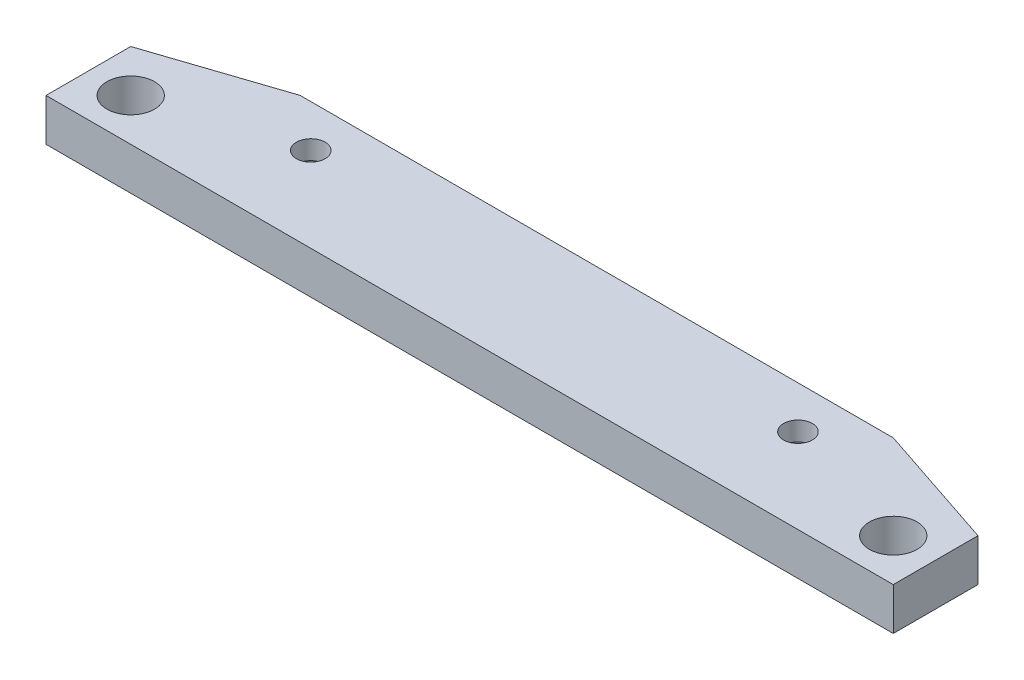
ISO-10303-21;
HEADER;
FILE_DESCRIPTION(('STEP AP214'),'2;1');
FILE_NAME('part.step','',(''),(''),'','','');
FILE_SCHEMA(('AUTOMOTIVE_DESIGN { 1 0 10303 214 1 1 1 1 }'));
ENDSEC;
DATA;
#1=APPLICATION_CONTEXT('core data for automotive mechanical design processes');
#2=APPLICATION_PROTOCOL_DEFINITION('international standard','automotive_design',2000,#1);
#3=PRODUCT_CONTEXT('',#1,'mechanical');
#4=PRODUCT('Part','Part','',(#3));
#5=PRODUCT_RELATED_PRODUCT_CATEGORY('part','',(#4));
#6=PRODUCT_DEFINITION_FORMATION('','',#4);
#7=PRODUCT_DEFINITION_CONTEXT('part definition',#1,'design');
#8=PRODUCT_DEFINITION('design','',#6,#7);
#9=PRODUCT_DEFINITION_SHAPE('','',#8);
#10=(LENGTH_UNIT() NAMED_UNIT(*) SI_UNIT(.MILLI.,.METRE.));
#11=(NAMED_UNIT(*) PLANE_ANGLE_UNIT() SI_UNIT($,.RADIAN.));
#12=(NAMED_UNIT(*) SI_UNIT($,.STERADIAN.) SOLID_ANGLE_UNIT());
#13=UNCERTAINTY_MEASURE_WITH_UNIT(LENGTH_MEASURE(1.E-05),#10,'distance_accuracy_value','');
#14=(GEOMETRIC_REPRESENTATION_CONTEXT(3) GLOBAL_UNCERTAINTY_ASSIGNED_CONTEXT((#13)) GLOBAL_UNIT_ASSIGNED_CONTEXT((#10,
#11,#12)) REPRESENTATION_CONTEXT('',''));
#15=CARTESIAN_POINT('',(0.,0.,0.));
#16=DIRECTION('',(0.,0.,1.));
#17=DIRECTION('',(1.,0.,0.));
#18=AXIS2_PLACEMENT_3D('',#15,#16,#17);
#19=CARTESIAN_POINT('',(-19.05,6.35,6.34999999999995));
#20=DIRECTION('',(-1.,0.,0.));
#21=DIRECTION('',(0.,0.,1.));
#22=AXIS2_PLACEMENT_3D('',#19,#20,#21);
#23=PLANE('',#22);
#24=DIRECTION('',(0.,0.,-1.));
#25=VECTOR('',#24,1.);
#26=CARTESIAN_POINT('',(-19.05,0.,6.34999999999995));
#27=LINE('',#26,#25);
#28=CARTESIAN_POINT('',(-19.05,0.,6.34999999999995));
#29=VERTEX_POINT('',#28);
#30=CARTESIAN_POINT('',(-19.05,0.,-6.35000000000002));
#31=VERTEX_POINT('',#30);
#32=EDGE_CURVE('E143',#29,#31,#27,.T.);
#33=ORIENTED_EDGE('',*,*,#32,.F.);
#34=DIRECTION('',(0.,-1.,0.));
#35=VECTOR('',#34,1.);
#36=CARTESIAN_POINT('',(-19.05,6.35,6.34999999999995));
#37=LINE('',#36,#35);
#38=CARTESIAN_POINT('',(-19.05,6.35,6.34999999999995));
#39=VERTEX_POINT('',#38);
#40=EDGE_CURVE('E11',#39,#29,#37,.T.);
#41=ORIENTED_EDGE('',*,*,#40,.F.);
#42=DIRECTION('',(0.,0.,-1.));
#43=VECTOR('',#42,1.);
#44=CARTESIAN_POINT('',(-19.05,6.35,6.34999999999995));
#45=LINE('',#44,#43);
#46=CARTESIAN_POINT('',(-19.05,6.35,-6.35000000000002));
#47=VERTEX_POINT('',#46);
#48=EDGE_CURVE('E162',#39,#47,#45,.T.);
#49=ORIENTED_EDGE('',*,*,#48,.T.);
#50=DIRECTION('',(0.,-1.,0.));
#51=VECTOR('',#50,1.);
#52=CARTESIAN_POINT('',(-19.05,6.35,-6.35000000000002));
#53=LINE('',#52,#51);
#54=EDGE_CURVE('E51',#47,#31,#53,.T.);
#55=ORIENTED_EDGE('',*,*,#54,.T.);
#56=EDGE_LOOP('',(#33,#41,#49,#55));
#57=FACE_BOUND('',#56,.T.);
#58=ADVANCED_FACE('F48',(#57),#23,.T.);
#59=CARTESIAN_POINT('',(-19.05,6.35,6.34999999999995));
#60=DIRECTION('',(0.,0.,-1.));
#61=DIRECTION('',(-1.,0.,0.));
#62=AXIS2_PLACEMENT_3D('',#59,#60,#61);
#63=PLANE('',#62);
#64=DIRECTION('',(1.,0.,0.));
#65=VECTOR('',#64,1.);
#66=CARTESIAN_POINT('',(-19.05,0.,6.34999999999995));
#67=LINE('',#66,#65);
#68=CARTESIAN_POINT('',(107.95,0.,6.34999999999998));
#69=VERTEX_POINT('',#68);
#70=EDGE_CURVE('E89',#29,#69,#67,.T.);
#71=ORIENTED_EDGE('',*,*,#70,.T.);
#72=DIRECTION('',(0.,-1.,0.));
#73=VECTOR('',#72,1.);
#74=CARTESIAN_POINT('',(107.95,6.35,6.34999999999998));
#75=LINE('',#74,#73);
#76=CARTESIAN_POINT('',(107.95,6.35,6.34999999999998));
#77=VERTEX_POINT('',#76);
#78=EDGE_CURVE('E58',#77,#69,#75,.T.);
#79=ORIENTED_EDGE('',*,*,#78,.F.);
#80=DIRECTION('',(1.,0.,0.));
#81=VECTOR('',#80,1.);
#82=CARTESIAN_POINT('',(-19.05,6.35,6.34999999999995));
#83=LINE('',#82,#81);
#84=EDGE_CURVE('E117',#39,#77,#83,.T.);
#85=ORIENTED_EDGE('',*,*,#84,.F.);
#86=ORIENTED_EDGE('',*,*,#40,.T.);
#87=EDGE_LOOP('',(#71,#79,#85,#86));
#88=FACE_BOUND('',#87,.T.);
#89=ADVANCED_FACE('F254',(#88),#63,.F.);
#90=CARTESIAN_POINT('',(107.95,6.35,6.34999999999998));
#91=DIRECTION('',(-1.,0.,0.));
#92=DIRECTION('',(0.,0.,1.));
#93=AXIS2_PLACEMENT_3D('',#90,#91,#92);
#94=PLANE('',#93);
#95=DIRECTION('',(0.,0.,-1.));
#96=VECTOR('',#95,1.);
#97=CARTESIAN_POINT('',(107.95,0.,6.34999999999998));
#98=LINE('',#97,#96);
#99=CARTESIAN_POINT('',(107.95,0.,-6.35000000000002));
#100=VERTEX_POINT('',#99);
#101=EDGE_CURVE('E125',#69,#100,#98,.T.);
#102=ORIENTED_EDGE('',*,*,#101,.T.);
#103=DIRECTION('',(0.,-1.,0.));
#104=VECTOR('',#103,1.);
#105=CARTESIAN_POINT('',(107.95,6.35,-6.35000000000002));
#106=LINE('',#105,#104);
#107=CARTESIAN_POINT('',(107.95,6.35,-6.35000000000002));
#108=VERTEX_POINT('',#107);
#109=EDGE_CURVE('E122',#108,#100,#106,.T.);
#110=ORIENTED_EDGE('',*,*,#109,.F.);
#111=DIRECTION('',(0.,0.,-1.));
#112=VECTOR('',#111,1.);
#113=CARTESIAN_POINT('',(107.95,6.35,6.34999999999998));
#114=LINE('',#113,#112);
#115=EDGE_CURVE('E109',#77,#108,#114,.T.);
#116=ORIENTED_EDGE('',*,*,#115,.F.);
#117=ORIENTED_EDGE('',*,*,#78,.T.);
#118=EDGE_LOOP('',(#102,#110,#116,#117));
#119=FACE_BOUND('',#118,.T.);
#120=ADVANCED_FACE('F123',(#119),#94,.F.);
#121=CARTESIAN_POINT('',(88.9,6.35,-12.7));
#122=DIRECTION('',(0.316227766016837,0.,-0.948683298050514));
#123=DIRECTION('',(-0.948683298050514,0.,-0.316227766016837));
#124=AXIS2_PLACEMENT_3D('',#121,#122,#123);
#125=PLANE('',#124);
#126=DIRECTION('',(0.948683298050514,0.,0.316227766016837));
#127=VECTOR('',#126,1.);
#128=CARTESIAN_POINT('',(88.9,0.,-12.7));
#129=LINE('',#128,#127);
#130=CARTESIAN_POINT('',(88.9,0.,-12.7));
#131=VERTEX_POINT('',#130);
#132=EDGE_CURVE('E156',#131,#100,#129,.T.);
#133=ORIENTED_EDGE('',*,*,#132,.F.);
#134=DIRECTION('',(0.,-1.,0.));
#135=VECTOR('',#134,1.);
#136=CARTESIAN_POINT('',(88.9,6.35,-12.7));
#137=LINE('',#136,#135);
#138=CARTESIAN_POINT('',(88.9,6.35,-12.7));
#139=VERTEX_POINT('',#138);
#140=EDGE_CURVE('E130',#139,#131,#137,.T.);
#141=ORIENTED_EDGE('',*,*,#140,.F.);
#142=DIRECTION('',(0.948683298050514,0.,0.316227766016837));
#143=VECTOR('',#142,1.);
#144=CARTESIAN_POINT('',(88.9,6.35,-12.7));
#145=LINE('',#144,#143);
#146=EDGE_CURVE('E115',#139,#108,#145,.T.);
#147=ORIENTED_EDGE('',*,*,#146,.T.);
#148=ORIENTED_EDGE('',*,*,#109,.T.);
#149=EDGE_LOOP('',(#133,#141,#147,#148));
#150=FACE_BOUND('',#149,.T.);
#151=ADVANCED_FACE('F132',(#150),#125,.T.);
#152=CARTESIAN_POINT('',(0.,6.35,-12.7));
#153=DIRECTION('',(0.,0.,-1.));
#154=DIRECTION('',(-1.,0.,0.));
#155=AXIS2_PLACEMENT_3D('',#152,#153,#154);
#156=PLANE('',#155);
#157=DIRECTION('',(1.,0.,0.));
#158=VECTOR('',#157,1.);
#159=CARTESIAN_POINT('',(0.,0.,-12.7));
#160=LINE('',#159,#158);
#161=CARTESIAN_POINT('',(0.,0.,-12.7));
#162=VERTEX_POINT('',#161);
#163=EDGE_CURVE('E152',#162,#131,#160,.T.);
#164=ORIENTED_EDGE('',*,*,#163,.F.);
#165=DIRECTION('',(0.,-1.,0.));
#166=VECTOR('',#165,1.);
#167=CARTESIAN_POINT('',(0.,6.35,-12.7));
#168=LINE('',#167,#166);
#169=CARTESIAN_POINT('',(0.,6.35,-12.7));
#170=VERTEX_POINT('',#169);
#171=EDGE_CURVE('E167',#170,#162,#168,.T.);
#172=ORIENTED_EDGE('',*,*,#171,.F.);
#173=DIRECTION('',(1.,0.,0.));
#174=VECTOR('',#173,1.);
#175=CARTESIAN_POINT('',(0.,6.35,-12.7));
#176=LINE('',#175,#174);
#177=EDGE_CURVE('E134',#170,#139,#176,.T.);
#178=ORIENTED_EDGE('',*,*,#177,.T.);
#179=ORIENTED_EDGE('',*,*,#140,.T.);
#180=EDGE_LOOP('',(#164,#172,#178,#179));
#181=FACE_BOUND('',#180,.T.);
#182=ADVANCED_FACE('F175',(#181),#156,.T.);
#183=CARTESIAN_POINT('',(-19.05,6.35,-6.35000000000002));
#184=DIRECTION('',(-0.316227766016837,0.,-0.948683298050514));
#185=DIRECTION('',(-0.948683298050514,0.,0.316227766016837));
#186=AXIS2_PLACEMENT_3D('',#183,#184,#185);
#187=PLANE('',#186);
#188=DIRECTION('',(0.948683298050514,0.,-0.316227766016837));
#189=VECTOR('',#188,1.);
#190=CARTESIAN_POINT('',(-19.05,0.,-6.35000000000002));
#191=LINE('',#190,#189);
#192=EDGE_CURVE('E147',#31,#162,#191,.T.);
#193=ORIENTED_EDGE('',*,*,#192,.F.);
#194=ORIENTED_EDGE('',*,*,#54,.F.);
#195=DIRECTION('',(0.948683298050514,0.,-0.316227766016837));
#196=VECTOR('',#195,1.);
#197=CARTESIAN_POINT('',(-19.05,6.35,-6.35000000000002));
#198=LINE('',#197,#196);
#199=EDGE_CURVE('E137',#47,#170,#198,.T.);
#200=ORIENTED_EDGE('',*,*,#199,.T.);
#201=ORIENTED_EDGE('',*,*,#171,.T.);
#202=EDGE_LOOP('',(#193,#194,#200,#201));
#203=FACE_BOUND('',#202,.T.);
#204=ADVANCED_FACE('F171',(#203),#187,.T.);
#205=CARTESIAN_POINT('',(0.,6.35,0.));
#206=DIRECTION('',(0.,-1.,0.));
#207=DIRECTION('',(0.,0.,-1.));
#208=AXIS2_PLACEMENT_3D('',#205,#206,#207);
#209=PLANE('',#208);
#210=CARTESIAN_POINT('',(80.9625,6.35,-6.35000000000002));
#211=DIRECTION('',(0.,-1.,0.));
#212=DIRECTION('',(0.,0.,-1.));
#213=AXIS2_PLACEMENT_3D('',#210,#211,#212);
#214=CIRCLE('',#213,2.15265000000001);
#215=CARTESIAN_POINT('',(80.9625,6.35,-8.50265000000003));
#216=VERTEX_POINT('',#215);
#217=EDGE_CURVE('E211',#216,#216,#214,.T.);
#218=ORIENTED_EDGE('',*,*,#217,.T.);
#219=EDGE_LOOP('',(#218));
#220=FACE_BOUND('',#219,.T.);
#221=CARTESIAN_POINT('',(7.9375,6.35,-6.35000000000005));
#222=DIRECTION('',(0.,-1.,0.));
#223=DIRECTION('',(0.,0.,-1.));
#224=AXIS2_PLACEMENT_3D('',#221,#222,#223);
#225=CIRCLE('',#224,2.15265000000002);
#226=CARTESIAN_POINT('',(7.9375,6.35,-8.50265000000007));
#227=VERTEX_POINT('',#226);
#228=EDGE_CURVE('E195',#227,#227,#225,.T.);
#229=ORIENTED_EDGE('',*,*,#228,.T.);
#230=EDGE_LOOP('',(#229));
#231=FACE_BOUND('',#230,.T.);
#232=CARTESIAN_POINT('',(101.6,6.35,0.));
#233=DIRECTION('',(0.,-1.,0.));
#234=DIRECTION('',(0.,0.,-1.));
#235=AXIS2_PLACEMENT_3D('',#232,#233,#234);
#236=CIRCLE('',#235,3.57123999999998);
#237=CARTESIAN_POINT('',(101.6,6.35,-3.57123999999998));
#238=VERTEX_POINT('',#237);
#239=EDGE_CURVE('E187',#238,#238,#236,.T.);
#240=ORIENTED_EDGE('',*,*,#239,.T.);
#241=EDGE_LOOP('',(#240));
#242=FACE_BOUND('',#241,.T.);
#243=CARTESIAN_POINT('',(-12.7,6.35,0.));
#244=DIRECTION('',(0.,-1.,0.));
#245=DIRECTION('',(0.,0.,-1.));
#246=AXIS2_PLACEMENT_3D('',#243,#244,#245);
#247=CIRCLE('',#246,3.57123999999998);
#248=CARTESIAN_POINT('',(-12.7,6.35,-3.57124000000002));
#249=VERTEX_POINT('',#248);
#250=EDGE_CURVE('E148',#249,#249,#247,.T.);
#251=ORIENTED_EDGE('',*,*,#250,.T.);
#252=EDGE_LOOP('',(#251));
#253=FACE_BOUND('',#252,.T.);
#254=ORIENTED_EDGE('',*,*,#48,.F.);
#255=ORIENTED_EDGE('',*,*,#84,.T.);
#256=ORIENTED_EDGE('',*,*,#115,.T.);
#257=ORIENTED_EDGE('',*,*,#146,.F.);
#258=ORIENTED_EDGE('',*,*,#177,.F.);
#259=ORIENTED_EDGE('',*,*,#199,.F.);
#260=EDGE_LOOP('',(#254,#255,#256,#257,#258,#259));
#261=FACE_BOUND('',#260,.T.);
#262=ADVANCED_FACE('F112',(#220,#231,#242,#253,#261),#209,.F.);
#263=CARTESIAN_POINT('',(0.,0.,0.));
#264=DIRECTION('',(0.,-1.,0.));
#265=DIRECTION('',(0.,0.,-1.));
#266=AXIS2_PLACEMENT_3D('',#263,#264,#265);
#267=PLANE('',#266);
#268=CARTESIAN_POINT('',(80.9625,0.,-6.35000000000002));
#269=DIRECTION('',(0.,-1.,0.));
#270=DIRECTION('',(0.,0.,-1.));
#271=AXIS2_PLACEMENT_3D('',#268,#269,#270);
#272=CIRCLE('',#271,3.57251);
#273=CARTESIAN_POINT('',(80.9625,0.,-9.92251000000002));
#274=VERTEX_POINT('',#273);
#275=EDGE_CURVE('E223',#274,#274,#272,.T.);
#276=ORIENTED_EDGE('',*,*,#275,.F.);
#277=EDGE_LOOP('',(#276));
#278=FACE_BOUND('',#277,.T.);
#279=CARTESIAN_POINT('',(7.9375,0.,-6.35000000000005));
#280=DIRECTION('',(0.,-1.,0.));
#281=DIRECTION('',(0.,0.,-1.));
#282=AXIS2_PLACEMENT_3D('',#279,#280,#281);
#283=CIRCLE('',#282,3.57251);
#284=CARTESIAN_POINT('',(7.9375,0.,-9.92251000000005));
#285=VERTEX_POINT('',#284);
#286=EDGE_CURVE('E207',#285,#285,#283,.T.);
#287=ORIENTED_EDGE('',*,*,#286,.F.);
#288=EDGE_LOOP('',(#287));
#289=FACE_BOUND('',#288,.T.);
#290=CARTESIAN_POINT('',(101.6,0.,0.));
#291=DIRECTION('',(0.,-1.,0.));
#292=DIRECTION('',(0.,0.,-1.));
#293=AXIS2_PLACEMENT_3D('',#290,#291,#292);
#294=CIRCLE('',#293,3.57123999999996);
#295=CARTESIAN_POINT('',(101.6,0.,-3.57123999999996));
#296=VERTEX_POINT('',#295);
#297=EDGE_CURVE('E191',#296,#296,#294,.T.);
#298=ORIENTED_EDGE('',*,*,#297,.F.);
#299=EDGE_LOOP('',(#298));
#300=FACE_BOUND('',#299,.T.);
#301=CARTESIAN_POINT('',(-12.7,0.,0.));
#302=DIRECTION('',(0.,-1.,0.));
#303=DIRECTION('',(0.,0.,-1.));
#304=AXIS2_PLACEMENT_3D('',#301,#302,#303);
#305=CIRCLE('',#304,3.57123999999996);
#306=CARTESIAN_POINT('',(-12.7,0.,-3.57124));
#307=VERTEX_POINT('',#306);
#308=EDGE_CURVE('E183',#307,#307,#305,.T.);
#309=ORIENTED_EDGE('',*,*,#308,.F.);
#310=EDGE_LOOP('',(#309));
#311=FACE_BOUND('',#310,.T.);
#312=ORIENTED_EDGE('',*,*,#32,.T.);
#313=ORIENTED_EDGE('',*,*,#192,.T.);
#314=ORIENTED_EDGE('',*,*,#163,.T.);
#315=ORIENTED_EDGE('',*,*,#132,.T.);
#316=ORIENTED_EDGE('',*,*,#101,.F.);
#317=ORIENTED_EDGE('',*,*,#70,.F.);
#318=EDGE_LOOP('',(#312,#313,#314,#315,#316,#317));
#319=FACE_BOUND('',#318,.T.);
#320=ADVANCED_FACE('F173',(#278,#289,#300,#311,#319),#267,.T.);
#321=CARTESIAN_POINT('',(-12.7,0.,0.));
#322=DIRECTION('',(0.,-1.,0.));
#323=DIRECTION('',(0.,0.,-1.));
#324=AXIS2_PLACEMENT_3D('',#321,#322,#323);
#325=CYLINDRICAL_SURFACE('',#324,3.57123999999998);
#326=ORIENTED_EDGE('',*,*,#250,.F.);
#327=EDGE_LOOP('',(#326));
#328=FACE_BOUND('',#327,.T.);
#329=ORIENTED_EDGE('',*,*,#308,.T.);
#330=EDGE_LOOP('',(#329));
#331=FACE_BOUND('',#330,.T.);
#332=ADVANCED_FACE('F232',(#328,#331),#325,.F.);
#333=CARTESIAN_POINT('',(101.6,0.,0.));
#334=DIRECTION('',(0.,-1.,0.));
#335=DIRECTION('',(0.,0.,-1.));
#336=AXIS2_PLACEMENT_3D('',#333,#334,#335);
#337=CYLINDRICAL_SURFACE('',#336,3.57123999999998);
#338=ORIENTED_EDGE('',*,*,#239,.F.);
#339=EDGE_LOOP('',(#338));
#340=FACE_BOUND('',#339,.T.);
#341=ORIENTED_EDGE('',*,*,#297,.T.);
#342=EDGE_LOOP('',(#341));
#343=FACE_BOUND('',#342,.T.);
#344=ADVANCED_FACE('F241',(#340,#343),#337,.F.);
#345=CARTESIAN_POINT('',(7.9375,0.,-6.35000000000005));
#346=DIRECTION('',(0.,-1.,0.));
#347=DIRECTION('',(0.,0.,-1.));
#348=AXIS2_PLACEMENT_3D('',#345,#346,#347);
#349=CYLINDRICAL_SURFACE('',#348,2.15265000000002);
#350=ORIENTED_EDGE('',*,*,#228,.F.);
#351=EDGE_LOOP('',(#350));
#352=FACE_BOUND('',#351,.T.);
#353=CARTESIAN_POINT('',(7.9375,3.5052,-6.35000000000005));
#354=DIRECTION('',(0.,-1.,0.));
#355=DIRECTION('',(0.,0.,-1.));
#356=AXIS2_PLACEMENT_3D('',#353,#354,#355);
#357=CIRCLE('',#356,2.15265000000004);
#358=CARTESIAN_POINT('',(7.9375,3.5052,-8.50265000000009));
#359=VERTEX_POINT('',#358);
#360=EDGE_CURVE('E199',#359,#359,#357,.T.);
#361=ORIENTED_EDGE('',*,*,#360,.T.);
#362=EDGE_LOOP('',(#361));
#363=FACE_BOUND('',#362,.T.);
#364=ADVANCED_FACE('F248',(#352,#363),#349,.F.);
#365=CARTESIAN_POINT('',(10.09015,3.5052,-6.35000000000005));
#366=DIRECTION('',(0.,1.,0.));
#367=DIRECTION('',(0.,0.,1.));
#368=AXIS2_PLACEMENT_3D('',#365,#366,#367);
#369=PLANE('',#368);
#370=ORIENTED_EDGE('',*,*,#360,.F.);
#371=EDGE_LOOP('',(#370));
#372=FACE_BOUND('',#371,.T.);
#373=CARTESIAN_POINT('',(7.9375,3.5052,-6.35000000000005));
#374=DIRECTION('',(0.,-1.,0.));
#375=DIRECTION('',(0.,0.,-1.));
#376=AXIS2_PLACEMENT_3D('',#373,#374,#375);
#377=CIRCLE('',#376,3.57251);
#378=CARTESIAN_POINT('',(7.9375,3.5052,-9.92251000000005));
#379=VERTEX_POINT('',#378);
#380=EDGE_CURVE('E203',#379,#379,#377,.T.);
#381=ORIENTED_EDGE('',*,*,#380,.T.);
#382=EDGE_LOOP('',(#381));
#383=FACE_BOUND('',#382,.T.);
#384=ADVANCED_FACE('F283',(#372,#383),#369,.F.);
#385=CARTESIAN_POINT('',(7.9375,0.,-6.35000000000005));
#386=DIRECTION('',(0.,-1.,0.));
#387=DIRECTION('',(0.,0.,-1.));
#388=AXIS2_PLACEMENT_3D('',#385,#386,#387);
#389=CYLINDRICAL_SURFACE('',#388,3.57251);
#390=ORIENTED_EDGE('',*,*,#380,.F.);
#391=EDGE_LOOP('',(#390));
#392=FACE_BOUND('',#391,.T.);
#393=ORIENTED_EDGE('',*,*,#286,.T.);
#394=EDGE_LOOP('',(#393));
#395=FACE_BOUND('',#394,.T.);
#396=ADVANCED_FACE('F289',(#392,#395),#389,.F.);
#397=CARTESIAN_POINT('',(80.9625,0.,-6.35000000000002));
#398=DIRECTION('',(0.,-1.,0.));
#399=DIRECTION('',(0.,0.,-1.));
#400=AXIS2_PLACEMENT_3D('',#397,#398,#399);
#401=CYLINDRICAL_SURFACE('',#400,2.15265000000001);
#402=ORIENTED_EDGE('',*,*,#217,.F.);
#403=EDGE_LOOP('',(#402));
#404=FACE_BOUND('',#403,.T.);
#405=CARTESIAN_POINT('',(80.9625,3.5052,-6.35000000000002));
#406=DIRECTION('',(0.,-1.,0.));
#407=DIRECTION('',(0.,0.,-1.));
#408=AXIS2_PLACEMENT_3D('',#405,#406,#407);
#409=CIRCLE('',#408,2.15265000000003);
#410=CARTESIAN_POINT('',(80.9625,3.5052,-8.50265000000005));
#411=VERTEX_POINT('',#410);
#412=EDGE_CURVE('E215',#411,#411,#409,.T.);
#413=ORIENTED_EDGE('',*,*,#412,.T.);
#414=EDGE_LOOP('',(#413));
#415=FACE_BOUND('',#414,.T.);
#416=ADVANCED_FACE('F295',(#404,#415),#401,.F.);
#417=CARTESIAN_POINT('',(83.11515,3.5052,-6.35000000000002));
#418=DIRECTION('',(0.,1.,0.));
#419=DIRECTION('',(0.,0.,1.));
#420=AXIS2_PLACEMENT_3D('',#417,#418,#419);
#421=PLANE('',#420);
#422=ORIENTED_EDGE('',*,*,#412,.F.);
#423=EDGE_LOOP('',(#422));
#424=FACE_BOUND('',#423,.T.);
#425=CARTESIAN_POINT('',(80.9625,3.5052,-6.35000000000002));
#426=DIRECTION('',(0.,-1.,0.));
#427=DIRECTION('',(0.,0.,-1.));
#428=AXIS2_PLACEMENT_3D('',#425,#426,#427);
#429=CIRCLE('',#428,3.57251);
#430=CARTESIAN_POINT('',(80.9625,3.5052,-9.92251000000002));
#431=VERTEX_POINT('',#430);
#432=EDGE_CURVE('E219',#431,#431,#429,.T.);
#433=ORIENTED_EDGE('',*,*,#432,.T.);
#434=EDGE_LOOP('',(#433));
#435=FACE_BOUND('',#434,.T.);
#436=ADVANCED_FACE('F300',(#424,#435),#421,.F.);
#437=CARTESIAN_POINT('',(80.9625,0.,-6.35000000000002));
#438=DIRECTION('',(0.,-1.,0.));
#439=DIRECTION('',(0.,0.,-1.));
#440=AXIS2_PLACEMENT_3D('',#437,#438,#439);
#441=CYLINDRICAL_SURFACE('',#440,3.57251);
#442=ORIENTED_EDGE('',*,*,#432,.F.);
#443=EDGE_LOOP('',(#442));
#444=FACE_BOUND('',#443,.T.);
#445=ORIENTED_EDGE('',*,*,#275,.T.);
#446=EDGE_LOOP('',(#445));
#447=FACE_BOUND('',#446,.T.);
#448=ADVANCED_FACE('F228',(#444,#447),#441,.F.);
#449=CLOSED_SHELL('',(#58,#89,#120,#151,#182,#204,#262,#320,#332,#344,#364,#384,#396,#416,#436,#448));
#450=MANIFOLD_SOLID_BREP('B2',#449);
#451=ADVANCED_BREP_SHAPE_REPRESENTATION('',(#18,#450),#14);
#452=SHAPE_DEFINITION_REPRESENTATION(#9,#451);
ENDSEC;
END-ISO-10303-21;
